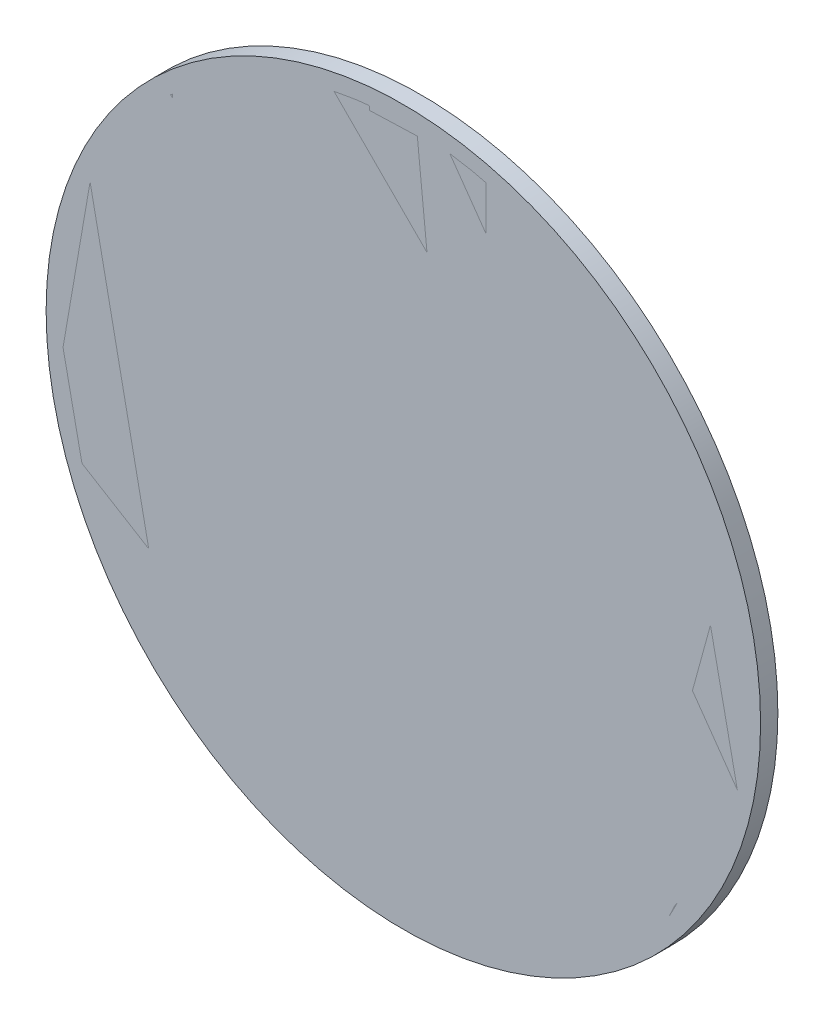
ISO-10303-21;
HEADER;
FILE_DESCRIPTION(('STEP AP214'),'2;1');
FILE_NAME('part.step','',(''),(''),'','','');
FILE_SCHEMA(('AUTOMOTIVE_DESIGN { 1 0 10303 214 1 1 1 1 }'));
ENDSEC;
DATA;
#1=APPLICATION_CONTEXT('core data for automotive mechanical design processes');
#2=APPLICATION_PROTOCOL_DEFINITION('international standard','automotive_design',2000,#1);
#3=PRODUCT_CONTEXT('',#1,'mechanical');
#4=PRODUCT('Part','Part','',(#3));
#5=PRODUCT_RELATED_PRODUCT_CATEGORY('part','',(#4));
#6=PRODUCT_DEFINITION_FORMATION('','',#4);
#7=PRODUCT_DEFINITION_CONTEXT('part definition',#1,'design');
#8=PRODUCT_DEFINITION('design','',#6,#7);
#9=PRODUCT_DEFINITION_SHAPE('','',#8);
#10=(LENGTH_UNIT() NAMED_UNIT(*) SI_UNIT(.MILLI.,.METRE.));
#11=(NAMED_UNIT(*) PLANE_ANGLE_UNIT() SI_UNIT($,.RADIAN.));
#12=(NAMED_UNIT(*) SI_UNIT($,.STERADIAN.) SOLID_ANGLE_UNIT());
#13=UNCERTAINTY_MEASURE_WITH_UNIT(LENGTH_MEASURE(1.E-05),#10,'distance_accuracy_value','');
#14=(GEOMETRIC_REPRESENTATION_CONTEXT(3) GLOBAL_UNCERTAINTY_ASSIGNED_CONTEXT((#13)) GLOBAL_UNIT_ASSIGNED_CONTEXT((#10,
#11,#12)) REPRESENTATION_CONTEXT('',''));
#15=CARTESIAN_POINT('',(0.,0.,0.));
#16=DIRECTION('',(0.,0.,1.));
#17=DIRECTION('',(1.,0.,0.));
#18=AXIS2_PLACEMENT_3D('',#15,#16,#17);
#19=CARTESIAN_POINT('',(0.,0.,0.));
#20=DIRECTION('',(0.,0.,1.));
#21=DIRECTION('',(1.,0.,0.));
#22=AXIS2_PLACEMENT_3D('',#19,#20,#21);
#23=CYLINDRICAL_SURFACE('',#22,31.);
#24=CARTESIAN_POINT('',(0.,0.,1.5));
#25=DIRECTION('',(0.,0.,1.));
#26=DIRECTION('',(1.,0.,0.));
#27=AXIS2_PLACEMENT_3D('',#24,#25,#26);
#28=CIRCLE('',#27,31.);
#29=CARTESIAN_POINT('',(31.,0.,1.5));
#30=VERTEX_POINT('',#29);
#31=EDGE_CURVE('P0_E51',#30,#30,#28,.T.);
#32=ORIENTED_EDGE('',*,*,#31,.F.);
#33=EDGE_LOOP('',(#32));
#34=FACE_BOUND('',#33,.T.);
#35=CARTESIAN_POINT('',(0.,0.,0.));
#36=DIRECTION('',(0.,0.,1.));
#37=DIRECTION('',(1.,0.,0.));
#38=AXIS2_PLACEMENT_3D('',#35,#36,#37);
#39=CIRCLE('',#38,31.);
#40=CARTESIAN_POINT('',(31.,0.,0.));
#41=VERTEX_POINT('',#40);
#42=EDGE_CURVE('P0_E10',#41,#41,#39,.T.);
#43=ORIENTED_EDGE('',*,*,#42,.T.);
#44=EDGE_LOOP('',(#43));
#45=FACE_BOUND('',#44,.T.);
#46=ADVANCED_FACE('P0_F47',(#34,#45),#23,.T.);
#47=CARTESIAN_POINT('',(0.,0.,1.5));
#48=DIRECTION('',(0.,0.,1.));
#49=DIRECTION('',(1.,0.,0.));
#50=AXIS2_PLACEMENT_3D('',#47,#48,#49);
#51=PLANE('',#50);
#52=ORIENTED_EDGE('',*,*,#31,.T.);
#53=EDGE_LOOP('',(#52));
#54=FACE_BOUND('',#53,.T.);
#55=ADVANCED_FACE('P0_F60',(#54),#51,.T.);
#56=CARTESIAN_POINT('',(0.,0.,0.));
#57=DIRECTION('',(0.,0.,1.));
#58=DIRECTION('',(1.,0.,0.));
#59=AXIS2_PLACEMENT_3D('',#56,#57,#58);
#60=PLANE('',#59);
#61=ORIENTED_EDGE('',*,*,#42,.F.);
#62=EDGE_LOOP('',(#61));
#63=FACE_BOUND('',#62,.T.);
#64=ADVANCED_FACE('P0_F49',(#63),#60,.F.);
#65=CLOSED_SHELL('',(#46,#55,#64));
#66=MANIFOLD_SOLID_BREP('P0_B2',#65);
#67=CARTESIAN_POINT('',(0.,0.,0.));
#68=DIRECTION('',(0.,0.,1.));
#69=DIRECTION('',(1.,0.,0.));
#70=AXIS2_PLACEMENT_3D('',#67,#68,#69);
#71=PLANE('',#70);
#72=CARTESIAN_POINT('',(0.,0.,0.));
#73=DIRECTION('',(0.,0.,1.));
#74=DIRECTION('',(1.,0.,0.));
#75=AXIS2_PLACEMENT_3D('',#72,#73,#74);
#76=CIRCLE('',#75,29.6);
#77=CARTESIAN_POINT('',(-29.6,0.,0.));
#78=VERTEX_POINT('',#77);
#79=CARTESIAN_POINT('',(29.6,0.,0.));
#80=VERTEX_POINT('',#79);
#81=EDGE_CURVE('P1_E11',#78,#80,#76,.T.);
#82=ORIENTED_EDGE('',*,*,#81,.F.);
#83=CARTESIAN_POINT('',(0.,0.,0.));
#84=DIRECTION('',(0.,0.,1.));
#85=DIRECTION('',(1.,0.,0.));
#86=AXIS2_PLACEMENT_3D('',#83,#84,#85);
#87=CIRCLE('',#86,29.6);
#88=EDGE_CURVE('P1_E65',#80,#78,#87,.T.);
#89=ORIENTED_EDGE('',*,*,#88,.F.);
#90=EDGE_LOOP('',(#82,#89));
#91=FACE_BOUND('',#90,.T.);
#92=ADVANCED_FACE('P1_F16',(#91),#71,.F.);
#93=CARTESIAN_POINT('',(0.,0.,1.5));
#94=DIRECTION('',(0.,0.,1.));
#95=DIRECTION('',(1.,0.,0.));
#96=AXIS2_PLACEMENT_3D('',#93,#94,#95);
#97=PLANE('',#96);
#98=CARTESIAN_POINT('',(0.,0.,1.5));
#99=DIRECTION('',(0.,0.,1.));
#100=DIRECTION('',(1.,0.,0.));
#101=AXIS2_PLACEMENT_3D('',#98,#99,#100);
#102=CIRCLE('',#101,29.6);
#103=CARTESIAN_POINT('',(-29.6,0.,1.5));
#104=VERTEX_POINT('',#103);
#105=CARTESIAN_POINT('',(29.6,0.,1.5));
#106=VERTEX_POINT('',#105);
#107=EDGE_CURVE('P1_E19',#104,#106,#102,.T.);
#108=ORIENTED_EDGE('',*,*,#107,.T.);
#109=CARTESIAN_POINT('',(0.,0.,1.5));
#110=DIRECTION('',(0.,0.,1.));
#111=DIRECTION('',(1.,0.,0.));
#112=AXIS2_PLACEMENT_3D('',#109,#110,#111);
#113=CIRCLE('',#112,29.6);
#114=EDGE_CURVE('P1_E55',#106,#104,#113,.T.);
#115=ORIENTED_EDGE('',*,*,#114,.T.);
#116=EDGE_LOOP('',(#108,#115));
#117=FACE_BOUND('',#116,.T.);
#118=ADVANCED_FACE('P1_F53',(#117),#97,.T.);
#119=CARTESIAN_POINT('',(0.,0.,1.5));
#120=DIRECTION('',(0.,0.,-1.));
#121=DIRECTION('',(-1.,0.,0.));
#122=AXIS2_PLACEMENT_3D('',#119,#120,#121);
#123=CYLINDRICAL_SURFACE('',#122,29.6);
#124=DIRECTION('',(0.,0.,-1.));
#125=VECTOR('',#124,1.);
#126=CARTESIAN_POINT('',(29.6,0.,1.5));
#127=LINE('',#126,#125);
#128=EDGE_CURVE('P1_E60',#106,#80,#127,.T.);
#129=ORIENTED_EDGE('',*,*,#128,.F.);
#130=ORIENTED_EDGE('',*,*,#107,.F.);
#131=DIRECTION('',(0.,0.,-1.));
#132=VECTOR('',#131,1.);
#133=CARTESIAN_POINT('',(-29.6,0.,1.5));
#134=LINE('',#133,#132);
#135=EDGE_CURVE('P1_E58',#104,#78,#134,.T.);
#136=ORIENTED_EDGE('',*,*,#135,.T.);
#137=ORIENTED_EDGE('',*,*,#81,.T.);
#138=EDGE_LOOP('',(#129,#130,#136,#137));
#139=FACE_BOUND('',#138,.T.);
#140=ADVANCED_FACE('P1_F61',(#139),#123,.T.);
#141=CARTESIAN_POINT('',(0.,0.,1.5));
#142=DIRECTION('',(0.,0.,-1.));
#143=DIRECTION('',(-1.,0.,0.));
#144=AXIS2_PLACEMENT_3D('',#141,#142,#143);
#145=CYLINDRICAL_SURFACE('',#144,29.6);
#146=ORIENTED_EDGE('',*,*,#114,.F.);
#147=ORIENTED_EDGE('',*,*,#128,.T.);
#148=ORIENTED_EDGE('',*,*,#88,.T.);
#149=ORIENTED_EDGE('',*,*,#135,.F.);
#150=EDGE_LOOP('',(#146,#147,#148,#149));
#151=FACE_BOUND('',#150,.T.);
#152=ADVANCED_FACE('P1_F67',(#151),#145,.T.);
#153=CLOSED_SHELL('',(#92,#118,#140,#152));
#154=MANIFOLD_SOLID_BREP('P1_B1',#153);
#155=ADVANCED_BREP_SHAPE_REPRESENTATION('',(#18,#66,#154),#14);
#156=SHAPE_DEFINITION_REPRESENTATION(#9,#155);
ENDSEC;
END-ISO-10303-21;
